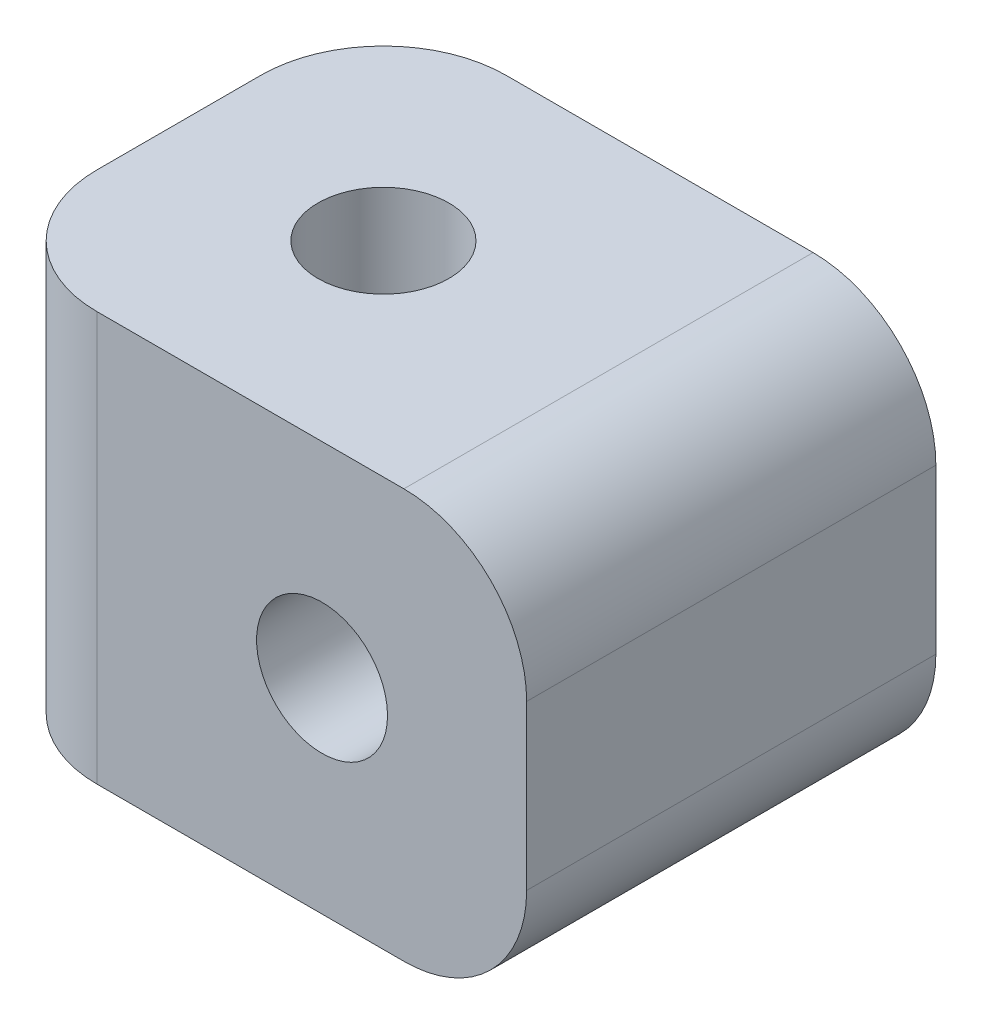
ISO-10303-21;
HEADER;
FILE_DESCRIPTION(('STEP AP214'),'2;1');
FILE_NAME('part.step','',(''),(''),'','','');
FILE_SCHEMA(('AUTOMOTIVE_DESIGN { 1 0 10303 214 1 1 1 1 }'));
ENDSEC;
DATA;
#1=APPLICATION_CONTEXT('core data for automotive mechanical design processes');
#2=APPLICATION_PROTOCOL_DEFINITION('international standard','automotive_design',2000,#1);
#3=PRODUCT_CONTEXT('',#1,'mechanical');
#4=PRODUCT('Part','Part','',(#3));
#5=PRODUCT_RELATED_PRODUCT_CATEGORY('part','',(#4));
#6=PRODUCT_DEFINITION_FORMATION('','',#4);
#7=PRODUCT_DEFINITION_CONTEXT('part definition',#1,'design');
#8=PRODUCT_DEFINITION('design','',#6,#7);
#9=PRODUCT_DEFINITION_SHAPE('','',#8);
#10=(LENGTH_UNIT() NAMED_UNIT(*) SI_UNIT(.MILLI.,.METRE.));
#11=(NAMED_UNIT(*) PLANE_ANGLE_UNIT() SI_UNIT($,.RADIAN.));
#12=(NAMED_UNIT(*) SI_UNIT($,.STERADIAN.) SOLID_ANGLE_UNIT());
#13=UNCERTAINTY_MEASURE_WITH_UNIT(LENGTH_MEASURE(1.E-05),#10,'distance_accuracy_value','');
#14=(GEOMETRIC_REPRESENTATION_CONTEXT(3) GLOBAL_UNCERTAINTY_ASSIGNED_CONTEXT((#13)) GLOBAL_UNIT_ASSIGNED_CONTEXT((#10,
#11,#12)) REPRESENTATION_CONTEXT('',''));
#15=CARTESIAN_POINT('',(0.,0.,0.));
#16=DIRECTION('',(0.,0.,1.));
#17=DIRECTION('',(1.,0.,0.));
#18=AXIS2_PLACEMENT_3D('',#15,#16,#17);
#19=CARTESIAN_POINT('',(0.,10.,0.));
#20=DIRECTION('',(1.,0.,0.));
#21=DIRECTION('',(0.,0.,-1.));
#22=AXIS2_PLACEMENT_3D('',#19,#20,#21);
#23=PLANE('',#22);
#24=DIRECTION('',(0.,0.,1.));
#25=VECTOR('',#24,1.);
#26=CARTESIAN_POINT('',(0.,10.,0.));
#27=LINE('',#26,#25);
#28=CARTESIAN_POINT('',(0.,10.,3.));
#29=VERTEX_POINT('',#28);
#30=CARTESIAN_POINT('',(0.,10.,7.));
#31=VERTEX_POINT('',#30);
#32=EDGE_CURVE('E129',#29,#31,#27,.T.);
#33=ORIENTED_EDGE('',*,*,#32,.F.);
#34=DIRECTION('',(0.,-1.,0.));
#35=VECTOR('',#34,1.);
#36=CARTESIAN_POINT('',(0.,10.,3.));
#37=LINE('',#36,#35);
#38=CARTESIAN_POINT('',(0.,0.,3.));
#39=VERTEX_POINT('',#38);
#40=EDGE_CURVE('E114',#29,#39,#37,.T.);
#41=ORIENTED_EDGE('',*,*,#40,.T.);
#42=DIRECTION('',(0.,0.,1.));
#43=VECTOR('',#42,1.);
#44=CARTESIAN_POINT('',(0.,0.,0.));
#45=LINE('',#44,#43);
#46=CARTESIAN_POINT('',(0.,0.,7.));
#47=VERTEX_POINT('',#46);
#48=EDGE_CURVE('E126',#39,#47,#45,.T.);
#49=ORIENTED_EDGE('',*,*,#48,.T.);
#50=DIRECTION('',(0.,-1.,0.));
#51=VECTOR('',#50,1.);
#52=CARTESIAN_POINT('',(0.,10.,7.));
#53=LINE('',#52,#51);
#54=EDGE_CURVE('E131',#47,#31,#53,.F.);
#55=ORIENTED_EDGE('',*,*,#54,.T.);
#56=EDGE_LOOP('',(#33,#41,#49,#55));
#57=FACE_BOUND('',#56,.T.);
#58=ADVANCED_FACE('F44',(#57),#23,.F.);
#59=CARTESIAN_POINT('',(0.,10.,10.));
#60=DIRECTION('',(0.,0.,-1.));
#61=DIRECTION('',(-1.,0.,0.));
#62=AXIS2_PLACEMENT_3D('',#59,#60,#61);
#63=PLANE('',#62);
#64=CARTESIAN_POINT('',(8.5,5.,10.));
#65=DIRECTION('',(0.,0.,1.));
#66=DIRECTION('',(1.,0.,0.));
#67=AXIS2_PLACEMENT_3D('',#64,#65,#66);
#68=CIRCLE('',#67,1.6);
#69=CARTESIAN_POINT('',(10.1,5.,10.));
#70=VERTEX_POINT('',#69);
#71=EDGE_CURVE('E141',#70,#70,#68,.T.);
#72=ORIENTED_EDGE('',*,*,#71,.F.);
#73=EDGE_LOOP('',(#72));
#74=FACE_BOUND('',#73,.T.);
#75=DIRECTION('',(1.,0.,0.));
#76=VECTOR('',#75,1.);
#77=CARTESIAN_POINT('',(0.,10.,10.));
#78=LINE('',#77,#76);
#79=CARTESIAN_POINT('',(3.,10.,10.));
#80=VERTEX_POINT('',#79);
#81=CARTESIAN_POINT('',(10.5,10.,10.));
#82=VERTEX_POINT('',#81);
#83=EDGE_CURVE('E176',#80,#82,#78,.T.);
#84=ORIENTED_EDGE('',*,*,#83,.F.);
#85=DIRECTION('',(0.,-1.,0.));
#86=VECTOR('',#85,1.);
#87=CARTESIAN_POINT('',(3.,10.,10.));
#88=LINE('',#87,#86);
#89=CARTESIAN_POINT('',(3.,0.,10.));
#90=VERTEX_POINT('',#89);
#91=EDGE_CURVE('E170',#80,#90,#88,.T.);
#92=ORIENTED_EDGE('',*,*,#91,.T.);
#93=DIRECTION('',(1.,0.,0.));
#94=VECTOR('',#93,1.);
#95=CARTESIAN_POINT('',(0.,0.,10.));
#96=LINE('',#95,#94);
#97=CARTESIAN_POINT('',(10.5,0.,10.));
#98=VERTEX_POINT('',#97);
#99=EDGE_CURVE('E135',#90,#98,#96,.T.);
#100=ORIENTED_EDGE('',*,*,#99,.T.);
#101=CARTESIAN_POINT('',(10.5,3.,10.));
#102=DIRECTION('',(0.,0.,-1.));
#103=DIRECTION('',(-1.,0.,0.));
#104=AXIS2_PLACEMENT_3D('',#101,#102,#103);
#105=CIRCLE('',#104,3.);
#106=CARTESIAN_POINT('',(13.5,3.,10.));
#107=VERTEX_POINT('',#106);
#108=EDGE_CURVE('E59',#98,#107,#105,.F.);
#109=ORIENTED_EDGE('',*,*,#108,.T.);
#110=DIRECTION('',(0.,-1.,0.));
#111=VECTOR('',#110,1.);
#112=CARTESIAN_POINT('',(13.5,10.,10.));
#113=LINE('',#112,#111);
#114=CARTESIAN_POINT('',(13.5,7.,10.));
#115=VERTEX_POINT('',#114);
#116=EDGE_CURVE('E151',#115,#107,#113,.T.);
#117=ORIENTED_EDGE('',*,*,#116,.F.);
#118=CARTESIAN_POINT('',(10.5,7.,10.));
#119=DIRECTION('',(0.,0.,-1.));
#120=DIRECTION('',(-1.,0.,0.));
#121=AXIS2_PLACEMENT_3D('',#118,#119,#120);
#122=CIRCLE('',#121,3.);
#123=EDGE_CURVE('E167',#115,#82,#122,.F.);
#124=ORIENTED_EDGE('',*,*,#123,.T.);
#125=EDGE_LOOP('',(#84,#92,#100,#109,#117,#124));
#126=FACE_BOUND('',#125,.T.);
#127=ADVANCED_FACE('F174',(#74,#126),#63,.F.);
#128=CARTESIAN_POINT('',(13.5,10.,0.));
#129=DIRECTION('',(-1.,0.,0.));
#130=DIRECTION('',(0.,0.,1.));
#131=AXIS2_PLACEMENT_3D('',#128,#129,#130);
#132=PLANE('',#131);
#133=ORIENTED_EDGE('',*,*,#116,.T.);
#134=DIRECTION('',(0.,0.,-1.));
#135=VECTOR('',#134,1.);
#136=CARTESIAN_POINT('',(13.5,3.,0.));
#137=LINE('',#136,#135);
#138=CARTESIAN_POINT('',(13.5,3.,0.));
#139=VERTEX_POINT('',#138);
#140=EDGE_CURVE('E13',#107,#139,#137,.T.);
#141=ORIENTED_EDGE('',*,*,#140,.T.);
#142=DIRECTION('',(0.,-1.,0.));
#143=VECTOR('',#142,1.);
#144=CARTESIAN_POINT('',(13.5,10.,0.));
#145=LINE('',#144,#143);
#146=CARTESIAN_POINT('',(13.5,7.,0.));
#147=VERTEX_POINT('',#146);
#148=EDGE_CURVE('E148',#147,#139,#145,.T.);
#149=ORIENTED_EDGE('',*,*,#148,.F.);
#150=DIRECTION('',(0.,0.,-1.));
#151=VECTOR('',#150,1.);
#152=CARTESIAN_POINT('',(13.5,7.,10.));
#153=LINE('',#152,#151);
#154=EDGE_CURVE('E52',#147,#115,#153,.F.);
#155=ORIENTED_EDGE('',*,*,#154,.T.);
#156=EDGE_LOOP('',(#133,#141,#149,#155));
#157=FACE_BOUND('',#156,.T.);
#158=ADVANCED_FACE('F183',(#157),#132,.F.);
#159=CARTESIAN_POINT('',(0.,10.,0.));
#160=DIRECTION('',(0.,0.,1.));
#161=DIRECTION('',(1.,0.,0.));
#162=AXIS2_PLACEMENT_3D('',#159,#160,#161);
#163=PLANE('',#162);
#164=CARTESIAN_POINT('',(8.5,5.,0.));
#165=DIRECTION('',(0.,0.,1.));
#166=DIRECTION('',(1.,0.,0.));
#167=AXIS2_PLACEMENT_3D('',#164,#165,#166);
#168=CIRCLE('',#167,1.6);
#169=CARTESIAN_POINT('',(10.1,5.,0.));
#170=VERTEX_POINT('',#169);
#171=EDGE_CURVE('E136',#170,#170,#168,.T.);
#172=ORIENTED_EDGE('',*,*,#171,.T.);
#173=EDGE_LOOP('',(#172));
#174=FACE_BOUND('',#173,.T.);
#175=DIRECTION('',(-1.,0.,0.));
#176=VECTOR('',#175,1.);
#177=CARTESIAN_POINT('',(0.,0.,0.));
#178=LINE('',#177,#176);
#179=CARTESIAN_POINT('',(10.5,0.,0.));
#180=VERTEX_POINT('',#179);
#181=CARTESIAN_POINT('',(3.,0.,0.));
#182=VERTEX_POINT('',#181);
#183=EDGE_CURVE('E138',#180,#182,#178,.T.);
#184=ORIENTED_EDGE('',*,*,#183,.T.);
#185=DIRECTION('',(0.,-1.,0.));
#186=VECTOR('',#185,1.);
#187=CARTESIAN_POINT('',(3.,10.,0.));
#188=LINE('',#187,#186);
#189=CARTESIAN_POINT('',(3.,10.,0.));
#190=VERTEX_POINT('',#189);
#191=EDGE_CURVE('E115',#182,#190,#188,.F.);
#192=ORIENTED_EDGE('',*,*,#191,.T.);
#193=DIRECTION('',(-1.,0.,0.));
#194=VECTOR('',#193,1.);
#195=CARTESIAN_POINT('',(0.,10.,0.));
#196=LINE('',#195,#194);
#197=CARTESIAN_POINT('',(10.5,10.,0.));
#198=VERTEX_POINT('',#197);
#199=EDGE_CURVE('E144',#198,#190,#196,.T.);
#200=ORIENTED_EDGE('',*,*,#199,.F.);
#201=CARTESIAN_POINT('',(10.5,7.,0.));
#202=DIRECTION('',(0.,0.,1.));
#203=DIRECTION('',(1.,0.,0.));
#204=AXIS2_PLACEMENT_3D('',#201,#202,#203);
#205=CIRCLE('',#204,3.);
#206=EDGE_CURVE('E120',#198,#147,#205,.F.);
#207=ORIENTED_EDGE('',*,*,#206,.T.);
#208=ORIENTED_EDGE('',*,*,#148,.T.);
#209=CARTESIAN_POINT('',(10.5,3.,0.));
#210=DIRECTION('',(0.,0.,1.));
#211=DIRECTION('',(1.,0.,0.));
#212=AXIS2_PLACEMENT_3D('',#209,#210,#211);
#213=CIRCLE('',#212,3.);
#214=EDGE_CURVE('E157',#139,#180,#213,.F.);
#215=ORIENTED_EDGE('',*,*,#214,.T.);
#216=EDGE_LOOP('',(#184,#192,#200,#207,#208,#215));
#217=FACE_BOUND('',#216,.T.);
#218=ADVANCED_FACE('F185',(#174,#217),#163,.F.);
#219=CARTESIAN_POINT('',(0.,10.,0.));
#220=DIRECTION('',(0.,1.,0.));
#221=DIRECTION('',(0.,0.,1.));
#222=AXIS2_PLACEMENT_3D('',#219,#220,#221);
#223=PLANE('',#222);
#224=CARTESIAN_POINT('',(5.,10.,5.));
#225=DIRECTION('',(0.,1.,0.));
#226=DIRECTION('',(0.,0.,1.));
#227=AXIS2_PLACEMENT_3D('',#224,#225,#226);
#228=CIRCLE('',#227,1.6);
#229=CARTESIAN_POINT('',(5.,10.,6.6));
#230=VERTEX_POINT('',#229);
#231=EDGE_CURVE('E198',#230,#230,#228,.T.);
#232=ORIENTED_EDGE('',*,*,#231,.F.);
#233=EDGE_LOOP('',(#232));
#234=FACE_BOUND('',#233,.T.);
#235=ORIENTED_EDGE('',*,*,#199,.T.);
#236=CARTESIAN_POINT('',(3.,10.,3.));
#237=DIRECTION('',(0.,1.,0.));
#238=DIRECTION('',(0.,0.,1.));
#239=AXIS2_PLACEMENT_3D('',#236,#237,#238);
#240=CIRCLE('',#239,3.);
#241=EDGE_CURVE('E165',#190,#29,#240,.T.);
#242=ORIENTED_EDGE('',*,*,#241,.T.);
#243=ORIENTED_EDGE('',*,*,#32,.T.);
#244=CARTESIAN_POINT('',(3.,10.,7.));
#245=DIRECTION('',(0.,1.,0.));
#246=DIRECTION('',(0.,0.,1.));
#247=AXIS2_PLACEMENT_3D('',#244,#245,#246);
#248=CIRCLE('',#247,3.);
#249=EDGE_CURVE('E163',#31,#80,#248,.T.);
#250=ORIENTED_EDGE('',*,*,#249,.T.);
#251=ORIENTED_EDGE('',*,*,#83,.T.);
#252=DIRECTION('',(0.,0.,-1.));
#253=VECTOR('',#252,1.);
#254=CARTESIAN_POINT('',(10.5,10.,0.));
#255=LINE('',#254,#253);
#256=EDGE_CURVE('E160',#82,#198,#255,.T.);
#257=ORIENTED_EDGE('',*,*,#256,.T.);
#258=EDGE_LOOP('',(#235,#242,#243,#250,#251,#257));
#259=FACE_BOUND('',#258,.T.);
#260=ADVANCED_FACE('F192',(#234,#259),#223,.T.);
#261=CARTESIAN_POINT('',(0.,0.,0.));
#262=DIRECTION('',(0.,1.,0.));
#263=DIRECTION('',(0.,0.,1.));
#264=AXIS2_PLACEMENT_3D('',#261,#262,#263);
#265=PLANE('',#264);
#266=CARTESIAN_POINT('',(5.,0.,5.));
#267=DIRECTION('',(0.,1.,0.));
#268=DIRECTION('',(0.,0.,1.));
#269=AXIS2_PLACEMENT_3D('',#266,#267,#268);
#270=CIRCLE('',#269,1.6);
#271=CARTESIAN_POINT('',(5.,0.,6.6));
#272=VERTEX_POINT('',#271);
#273=EDGE_CURVE('E196',#272,#272,#270,.T.);
#274=ORIENTED_EDGE('',*,*,#273,.T.);
#275=EDGE_LOOP('',(#274));
#276=FACE_BOUND('',#275,.T.);
#277=ORIENTED_EDGE('',*,*,#48,.F.);
#278=CARTESIAN_POINT('',(3.,0.,3.));
#279=DIRECTION('',(0.,1.,0.));
#280=DIRECTION('',(0.,0.,1.));
#281=AXIS2_PLACEMENT_3D('',#278,#279,#280);
#282=CIRCLE('',#281,3.);
#283=EDGE_CURVE('E110',#39,#182,#282,.F.);
#284=ORIENTED_EDGE('',*,*,#283,.T.);
#285=ORIENTED_EDGE('',*,*,#183,.F.);
#286=DIRECTION('',(0.,0.,-1.));
#287=VECTOR('',#286,1.);
#288=CARTESIAN_POINT('',(10.5,0.,0.));
#289=LINE('',#288,#287);
#290=EDGE_CURVE('E130',#180,#98,#289,.F.);
#291=ORIENTED_EDGE('',*,*,#290,.T.);
#292=ORIENTED_EDGE('',*,*,#99,.F.);
#293=CARTESIAN_POINT('',(3.,0.,7.));
#294=DIRECTION('',(0.,1.,0.));
#295=DIRECTION('',(0.,0.,1.));
#296=AXIS2_PLACEMENT_3D('',#293,#294,#295);
#297=CIRCLE('',#296,3.);
#298=EDGE_CURVE('E121',#90,#47,#297,.F.);
#299=ORIENTED_EDGE('',*,*,#298,.T.);
#300=EDGE_LOOP('',(#277,#284,#285,#291,#292,#299));
#301=FACE_BOUND('',#300,.T.);
#302=ADVANCED_FACE('F133',(#276,#301),#265,.F.);
#303=CARTESIAN_POINT('',(8.5,5.,0.));
#304=DIRECTION('',(0.,0.,1.));
#305=DIRECTION('',(1.,0.,0.));
#306=AXIS2_PLACEMENT_3D('',#303,#304,#305);
#307=CYLINDRICAL_SURFACE('',#306,1.6);
#308=ORIENTED_EDGE('',*,*,#171,.F.);
#309=EDGE_LOOP('',(#308));
#310=FACE_BOUND('',#309,.T.);
#311=ORIENTED_EDGE('',*,*,#71,.T.);
#312=EDGE_LOOP('',(#311));
#313=FACE_BOUND('',#312,.T.);
#314=ADVANCED_FACE('F208',(#310,#313),#307,.F.);
#315=CARTESIAN_POINT('',(5.,0.,5.));
#316=DIRECTION('',(0.,1.,0.));
#317=DIRECTION('',(0.,0.,1.));
#318=AXIS2_PLACEMENT_3D('',#315,#316,#317);
#319=CYLINDRICAL_SURFACE('',#318,1.6);
#320=ORIENTED_EDGE('',*,*,#273,.F.);
#321=EDGE_LOOP('',(#320));
#322=FACE_BOUND('',#321,.T.);
#323=ORIENTED_EDGE('',*,*,#231,.T.);
#324=EDGE_LOOP('',(#323));
#325=FACE_BOUND('',#324,.T.);
#326=ADVANCED_FACE('F205',(#322,#325),#319,.F.);
#327=CARTESIAN_POINT('',(3.,10.,3.));
#328=DIRECTION('',(0.,-1.,0.));
#329=DIRECTION('',(0.,0.,-1.));
#330=AXIS2_PLACEMENT_3D('',#327,#328,#329);
#331=CYLINDRICAL_SURFACE('',#330,3.);
#332=ORIENTED_EDGE('',*,*,#241,.F.);
#333=ORIENTED_EDGE('',*,*,#191,.F.);
#334=ORIENTED_EDGE('',*,*,#283,.F.);
#335=ORIENTED_EDGE('',*,*,#40,.F.);
#336=EDGE_LOOP('',(#332,#333,#334,#335));
#337=FACE_BOUND('',#336,.T.);
#338=ADVANCED_FACE('F113',(#337),#331,.T.);
#339=CARTESIAN_POINT('',(3.,10.,7.));
#340=DIRECTION('',(0.,-1.,0.));
#341=DIRECTION('',(0.,0.,-1.));
#342=AXIS2_PLACEMENT_3D('',#339,#340,#341);
#343=CYLINDRICAL_SURFACE('',#342,3.);
#344=ORIENTED_EDGE('',*,*,#249,.F.);
#345=ORIENTED_EDGE('',*,*,#54,.F.);
#346=ORIENTED_EDGE('',*,*,#298,.F.);
#347=ORIENTED_EDGE('',*,*,#91,.F.);
#348=EDGE_LOOP('',(#344,#345,#346,#347));
#349=FACE_BOUND('',#348,.T.);
#350=ADVANCED_FACE('F233',(#349),#343,.T.);
#351=CARTESIAN_POINT('',(10.5,3.,0.));
#352=DIRECTION('',(0.,0.,-1.));
#353=DIRECTION('',(-1.,0.,0.));
#354=AXIS2_PLACEMENT_3D('',#351,#352,#353);
#355=CYLINDRICAL_SURFACE('',#354,3.);
#356=ORIENTED_EDGE('',*,*,#108,.F.);
#357=ORIENTED_EDGE('',*,*,#290,.F.);
#358=ORIENTED_EDGE('',*,*,#214,.F.);
#359=ORIENTED_EDGE('',*,*,#140,.F.);
#360=EDGE_LOOP('',(#356,#357,#358,#359));
#361=FACE_BOUND('',#360,.T.);
#362=ADVANCED_FACE('F181',(#361),#355,.T.);
#363=CARTESIAN_POINT('',(10.5,7.,0.));
#364=DIRECTION('',(0.,0.,1.));
#365=DIRECTION('',(1.,0.,0.));
#366=AXIS2_PLACEMENT_3D('',#363,#364,#365);
#367=CYLINDRICAL_SURFACE('',#366,3.);
#368=ORIENTED_EDGE('',*,*,#123,.F.);
#369=ORIENTED_EDGE('',*,*,#154,.F.);
#370=ORIENTED_EDGE('',*,*,#206,.F.);
#371=ORIENTED_EDGE('',*,*,#256,.F.);
#372=EDGE_LOOP('',(#368,#369,#370,#371));
#373=FACE_BOUND('',#372,.T.);
#374=ADVANCED_FACE('F46',(#373),#367,.T.);
#375=CLOSED_SHELL('',(#58,#127,#158,#218,#260,#302,#314,#326,#338,#350,#362,#374));
#376=MANIFOLD_SOLID_BREP('B2',#375);
#377=ADVANCED_BREP_SHAPE_REPRESENTATION('',(#18,#376),#14);
#378=SHAPE_DEFINITION_REPRESENTATION(#9,#377);
ENDSEC;
END-ISO-10303-21;
